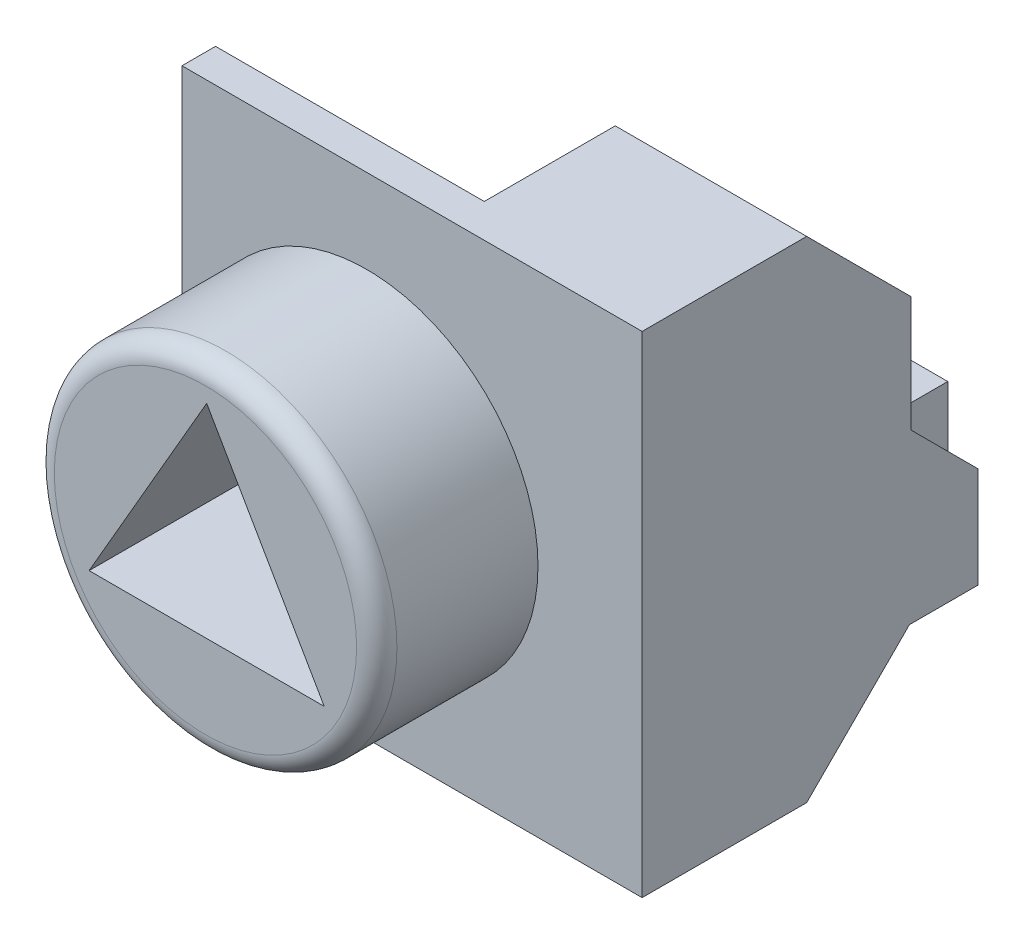
ISO-10303-21;
HEADER;
FILE_DESCRIPTION(('STEP AP214'),'2;1');
FILE_NAME('part.step','',(''),(''),'','','');
FILE_SCHEMA(('AUTOMOTIVE_DESIGN { 1 0 10303 214 1 1 1 1 }'));
ENDSEC;
DATA;
#1=APPLICATION_CONTEXT('core data for automotive mechanical design processes');
#2=APPLICATION_PROTOCOL_DEFINITION('international standard','automotive_design',2000,#1);
#3=PRODUCT_CONTEXT('',#1,'mechanical');
#4=PRODUCT('Part','Part','',(#3));
#5=PRODUCT_RELATED_PRODUCT_CATEGORY('part','',(#4));
#6=PRODUCT_DEFINITION_FORMATION('','',#4);
#7=PRODUCT_DEFINITION_CONTEXT('part definition',#1,'design');
#8=PRODUCT_DEFINITION('design','',#6,#7);
#9=PRODUCT_DEFINITION_SHAPE('','',#8);
#10=(LENGTH_UNIT() NAMED_UNIT(*) SI_UNIT(.MILLI.,.METRE.));
#11=(NAMED_UNIT(*) PLANE_ANGLE_UNIT() SI_UNIT($,.RADIAN.));
#12=(NAMED_UNIT(*) SI_UNIT($,.STERADIAN.) SOLID_ANGLE_UNIT());
#13=UNCERTAINTY_MEASURE_WITH_UNIT(LENGTH_MEASURE(1.E-05),#10,'distance_accuracy_value','');
#14=(GEOMETRIC_REPRESENTATION_CONTEXT(3) GLOBAL_UNCERTAINTY_ASSIGNED_CONTEXT((#13)) GLOBAL_UNIT_ASSIGNED_CONTEXT((#10,
#11,#12)) REPRESENTATION_CONTEXT('',''));
#15=CARTESIAN_POINT('',(0.,0.,0.));
#16=DIRECTION('',(0.,0.,1.));
#17=DIRECTION('',(1.,0.,0.));
#18=AXIS2_PLACEMENT_3D('',#15,#16,#17);
#19=CARTESIAN_POINT('',(0.,0.,-1.));
#20=DIRECTION('',(0.,0.,-1.));
#21=DIRECTION('',(-1.,0.,0.));
#22=AXIS2_PLACEMENT_3D('',#19,#20,#21);
#23=PLANE('',#22);
#24=CARTESIAN_POINT('',(0.,9.48,-1.));
#25=DIRECTION('',(0.,0.,1.));
#26=DIRECTION('',(1.,0.,0.));
#27=AXIS2_PLACEMENT_3D('',#24,#25,#26);
#28=CIRCLE('',#27,1.);
#29=CARTESIAN_POINT('',(1.,9.48,-1.));
#30=VERTEX_POINT('',#29);
#31=EDGE_CURVE('E267',#30,#30,#28,.T.);
#32=ORIENTED_EDGE('',*,*,#31,.T.);
#33=EDGE_LOOP('',(#32));
#34=FACE_BOUND('',#33,.T.);
#35=DIRECTION('',(1.,0.,0.));
#36=VECTOR('',#35,1.);
#37=CARTESIAN_POINT('',(5.5,17.08,-1.));
#38=LINE('',#37,#36);
#39=CARTESIAN_POINT('',(-5.5,17.08,-1.));
#40=VERTEX_POINT('',#39);
#41=CARTESIAN_POINT('',(2.5,17.08,-1.));
#42=VERTEX_POINT('',#41);
#43=EDGE_CURVE('E319',#40,#42,#38,.T.);
#44=ORIENTED_EDGE('',*,*,#43,.T.);
#45=DIRECTION('',(0.,1.,0.));
#46=VECTOR('',#45,1.);
#47=CARTESIAN_POINT('',(2.5,17.08,-1.));
#48=LINE('',#47,#46);
#49=CARTESIAN_POINT('',(2.5,2.48,-1.));
#50=VERTEX_POINT('',#49);
#51=EDGE_CURVE('E244',#50,#42,#48,.T.);
#52=ORIENTED_EDGE('',*,*,#51,.F.);
#53=DIRECTION('',(-1.,0.,0.));
#54=VECTOR('',#53,1.);
#55=CARTESIAN_POINT('',(5.5,2.48,-1.));
#56=LINE('',#55,#54);
#57=CARTESIAN_POINT('',(-5.5,2.48,-1.));
#58=VERTEX_POINT('',#57);
#59=EDGE_CURVE('E312',#50,#58,#56,.T.);
#60=ORIENTED_EDGE('',*,*,#59,.T.);
#61=DIRECTION('',(0.,1.,0.));
#62=VECTOR('',#61,1.);
#63=CARTESIAN_POINT('',(-5.5,17.08,-1.));
#64=LINE('',#63,#62);
#65=EDGE_CURVE('E315',#58,#40,#64,.T.);
#66=ORIENTED_EDGE('',*,*,#65,.T.);
#67=EDGE_LOOP('',(#44,#52,#60,#66));
#68=FACE_BOUND('',#67,.T.);
#69=ADVANCED_FACE('F45',(#34,#68),#23,.T.);
#70=CARTESIAN_POINT('',(0.,9.48,4.8));
#71=DIRECTION('',(0.,0.,-1.));
#72=DIRECTION('',(-1.,0.,0.));
#73=AXIS2_PLACEMENT_3D('',#70,#71,#72);
#74=CYLINDRICAL_SURFACE('',#73,5.1);
#75=CARTESIAN_POINT('',(0.,9.48,4.2));
#76=DIRECTION('',(0.,0.,1.));
#77=DIRECTION('',(1.,0.,0.));
#78=AXIS2_PLACEMENT_3D('',#75,#76,#77);
#79=CIRCLE('',#78,5.1);
#80=CARTESIAN_POINT('',(5.1,9.48,4.2));
#81=VERTEX_POINT('',#80);
#82=EDGE_CURVE('E346',#81,#81,#79,.F.);
#83=ORIENTED_EDGE('',*,*,#82,.T.);
#84=EDGE_LOOP('',(#83));
#85=FACE_BOUND('',#84,.T.);
#86=CARTESIAN_POINT('',(0.,9.48,0.));
#87=DIRECTION('',(0.,0.,1.));
#88=DIRECTION('',(1.,0.,0.));
#89=AXIS2_PLACEMENT_3D('',#86,#87,#88);
#90=CIRCLE('',#89,5.1);
#91=CARTESIAN_POINT('',(5.1,9.48,0.));
#92=VERTEX_POINT('',#91);
#93=EDGE_CURVE('E338',#92,#92,#90,.T.);
#94=ORIENTED_EDGE('',*,*,#93,.T.);
#95=EDGE_LOOP('',(#94));
#96=FACE_BOUND('',#95,.T.);
#97=ADVANCED_FACE('F457',(#85,#96),#74,.T.);
#98=CARTESIAN_POINT('',(0.,9.48,4.8));
#99=DIRECTION('',(0.,0.,1.));
#100=DIRECTION('',(1.,0.,0.));
#101=AXIS2_PLACEMENT_3D('',#98,#99,#100);
#102=PLANE('',#101);
#103=DIRECTION('',(-0.5,0.866025403784438,0.));
#104=VECTOR('',#103,1.);
#105=CARTESIAN_POINT('',(3.53589838486225,7.48,4.8));
#106=LINE('',#105,#104);
#107=CARTESIAN_POINT('',(3.53589838486225,7.48,4.8));
#108=VERTEX_POINT('',#107);
#109=CARTESIAN_POINT('',(0.0358983848622429,13.5421778264911,4.8));
#110=VERTEX_POINT('',#109);
#111=EDGE_CURVE('E271',#108,#110,#106,.T.);
#112=ORIENTED_EDGE('',*,*,#111,.F.);
#113=DIRECTION('',(1.,0.,0.));
#114=VECTOR('',#113,1.);
#115=CARTESIAN_POINT('',(-3.46410161513775,7.48,4.8));
#116=LINE('',#115,#114);
#117=CARTESIAN_POINT('',(-3.46410161513775,7.48,4.8));
#118=VERTEX_POINT('',#117);
#119=EDGE_CURVE('E280',#118,#108,#116,.T.);
#120=ORIENTED_EDGE('',*,*,#119,.F.);
#121=DIRECTION('',(-0.5,-0.866025403784439,0.));
#122=VECTOR('',#121,1.);
#123=CARTESIAN_POINT('',(0.0358983848622436,13.5421778264911,4.8));
#124=LINE('',#123,#122);
#125=EDGE_CURVE('E291',#110,#118,#124,.T.);
#126=ORIENTED_EDGE('',*,*,#125,.F.);
#127=EDGE_LOOP('',(#112,#120,#126));
#128=FACE_BOUND('',#127,.T.);
#129=CARTESIAN_POINT('',(0.,9.48,4.8));
#130=DIRECTION('',(0.,0.,1.));
#131=DIRECTION('',(1.,0.,0.));
#132=AXIS2_PLACEMENT_3D('',#129,#130,#131);
#133=CIRCLE('',#132,4.5);
#134=CARTESIAN_POINT('',(4.5,9.48,4.8));
#135=VERTEX_POINT('',#134);
#136=EDGE_CURVE('E342',#135,#135,#133,.T.);
#137=ORIENTED_EDGE('',*,*,#136,.T.);
#138=EDGE_LOOP('',(#137));
#139=FACE_BOUND('',#138,.T.);
#140=ADVANCED_FACE('F462',(#128,#139),#102,.T.);
#141=CARTESIAN_POINT('',(5.5,17.08,-1.));
#142=DIRECTION('',(-1.,0.,0.));
#143=DIRECTION('',(0.,-1.,0.));
#144=AXIS2_PLACEMENT_3D('',#141,#142,#143);
#145=PLANE('',#144);
#146=DIRECTION('',(0.,0.,-1.));
#147=VECTOR('',#146,1.);
#148=CARTESIAN_POINT('',(5.5,8.53846540433701,-1.8));
#149=LINE('',#148,#147);
#150=CARTESIAN_POINT('',(5.5,8.53846540433701,-10.));
#151=VERTEX_POINT('',#150);
#152=CARTESIAN_POINT('',(5.5,8.53846540433701,-11.8));
#153=VERTEX_POINT('',#152);
#154=EDGE_CURVE('E241',#151,#153,#149,.T.);
#155=ORIENTED_EDGE('',*,*,#154,.F.);
#156=DIRECTION('',(0.,-1.,0.));
#157=VECTOR('',#156,1.);
#158=CARTESIAN_POINT('',(5.5,0.,-10.));
#159=LINE('',#158,#157);
#160=CARTESIAN_POINT('',(5.5,5.53846540433701,-10.));
#161=VERTEX_POINT('',#160);
#162=EDGE_CURVE('E177',#151,#161,#159,.T.);
#163=ORIENTED_EDGE('',*,*,#162,.T.);
#164=DIRECTION('',(0.,0.,-1.));
#165=VECTOR('',#164,1.);
#166=CARTESIAN_POINT('',(5.5,5.53846540433701,-1.8));
#167=LINE('',#166,#165);
#168=CARTESIAN_POINT('',(5.5,5.53846540433701,-11.8));
#169=VERTEX_POINT('',#168);
#170=EDGE_CURVE('E240',#161,#169,#167,.T.);
#171=ORIENTED_EDGE('',*,*,#170,.T.);
#172=DIRECTION('',(0.,-1.,0.));
#173=VECTOR('',#172,1.);
#174=CARTESIAN_POINT('',(5.5,8.07435186760056,-11.8));
#175=LINE('',#174,#173);
#176=EDGE_CURVE('E301',#153,#169,#175,.T.);
#177=ORIENTED_EDGE('',*,*,#176,.F.);
#178=EDGE_LOOP('',(#155,#163,#171,#177));
#179=FACE_BOUND('',#178,.T.);
#180=ADVANCED_FACE('F438',(#179),#145,.F.);
#181=CARTESIAN_POINT('',(5.5,2.48,-1.));
#182=DIRECTION('',(0.,1.,0.));
#183=DIRECTION('',(0.,0.,1.));
#184=AXIS2_PLACEMENT_3D('',#181,#182,#183);
#185=PLANE('',#184);
#186=DIRECTION('',(0.,0.,1.));
#187=VECTOR('',#186,1.);
#188=CARTESIAN_POINT('',(2.5,2.48,-8.));
#189=LINE('',#188,#187);
#190=CARTESIAN_POINT('',(2.5,2.48,-4.89999999999999));
#191=VERTEX_POINT('',#190);
#192=EDGE_CURVE('E263',#191,#50,#189,.T.);
#193=ORIENTED_EDGE('',*,*,#192,.F.);
#194=DIRECTION('',(1.,0.,0.));
#195=VECTOR('',#194,1.);
#196=CARTESIAN_POINT('',(5.5,2.48,-4.89999999999999));
#197=LINE('',#196,#195);
#198=CARTESIAN_POINT('',(8.2,2.48,-4.89999999999999));
#199=VERTEX_POINT('',#198);
#200=EDGE_CURVE('E359',#191,#199,#197,.T.);
#201=ORIENTED_EDGE('',*,*,#200,.T.);
#202=DIRECTION('',(0.,0.,-1.));
#203=VECTOR('',#202,1.);
#204=CARTESIAN_POINT('',(8.2,2.48,0.));
#205=LINE('',#204,#203);
#206=CARTESIAN_POINT('',(8.2,2.48,0.));
#207=VERTEX_POINT('',#206);
#208=EDGE_CURVE('E218',#207,#199,#205,.T.);
#209=ORIENTED_EDGE('',*,*,#208,.F.);
#210=DIRECTION('',(-1.,0.,0.));
#211=VECTOR('',#210,1.);
#212=CARTESIAN_POINT('',(5.5,2.48,0.));
#213=LINE('',#212,#211);
#214=CARTESIAN_POINT('',(-5.5,2.48,0.));
#215=VERTEX_POINT('',#214);
#216=EDGE_CURVE('E311',#207,#215,#213,.T.);
#217=ORIENTED_EDGE('',*,*,#216,.T.);
#218=DIRECTION('',(0.,0.,1.));
#219=VECTOR('',#218,1.);
#220=CARTESIAN_POINT('',(-5.5,2.48,-1.));
#221=LINE('',#220,#219);
#222=EDGE_CURVE('E334',#58,#215,#221,.T.);
#223=ORIENTED_EDGE('',*,*,#222,.F.);
#224=ORIENTED_EDGE('',*,*,#59,.F.);
#225=EDGE_LOOP('',(#193,#201,#209,#217,#223,#224));
#226=FACE_BOUND('',#225,.T.);
#227=ADVANCED_FACE('F430',(#226),#185,.F.);
#228=CARTESIAN_POINT('',(-5.5,17.08,-1.));
#229=DIRECTION('',(1.,0.,0.));
#230=DIRECTION('',(0.,1.,0.));
#231=AXIS2_PLACEMENT_3D('',#228,#229,#230);
#232=PLANE('',#231);
#233=DIRECTION('',(0.,1.,0.));
#234=VECTOR('',#233,1.);
#235=CARTESIAN_POINT('',(-5.5,17.08,0.));
#236=LINE('',#235,#234);
#237=CARTESIAN_POINT('',(-5.5,17.08,0.));
#238=VERTEX_POINT('',#237);
#239=EDGE_CURVE('E326',#215,#238,#236,.T.);
#240=ORIENTED_EDGE('',*,*,#239,.T.);
#241=DIRECTION('',(0.,0.,1.));
#242=VECTOR('',#241,1.);
#243=CARTESIAN_POINT('',(-5.5,17.08,-1.));
#244=LINE('',#243,#242);
#245=EDGE_CURVE('E323',#40,#238,#244,.T.);
#246=ORIENTED_EDGE('',*,*,#245,.F.);
#247=ORIENTED_EDGE('',*,*,#65,.F.);
#248=ORIENTED_EDGE('',*,*,#222,.T.);
#249=EDGE_LOOP('',(#240,#246,#247,#248));
#250=FACE_BOUND('',#249,.T.);
#251=ADVANCED_FACE('F468',(#250),#232,.F.);
#252=CARTESIAN_POINT('',(5.5,17.08,-1.));
#253=DIRECTION('',(0.,-1.,0.));
#254=DIRECTION('',(0.,0.,-1.));
#255=AXIS2_PLACEMENT_3D('',#252,#253,#254);
#256=PLANE('',#255);
#257=DIRECTION('',(1.,0.,0.));
#258=VECTOR('',#257,1.);
#259=CARTESIAN_POINT('',(5.5,17.08,0.));
#260=LINE('',#259,#258);
#261=CARTESIAN_POINT('',(8.20000000000001,17.08,0.));
#262=VERTEX_POINT('',#261);
#263=EDGE_CURVE('E316',#238,#262,#260,.T.);
#264=ORIENTED_EDGE('',*,*,#263,.T.);
#265=DIRECTION('',(0.,0.,1.));
#266=VECTOR('',#265,1.);
#267=CARTESIAN_POINT('',(8.20000000000001,17.08,0.));
#268=LINE('',#267,#266);
#269=CARTESIAN_POINT('',(8.20000000000001,17.08,-4.89999999999999));
#270=VERTEX_POINT('',#269);
#271=EDGE_CURVE('E210',#270,#262,#268,.T.);
#272=ORIENTED_EDGE('',*,*,#271,.F.);
#273=DIRECTION('',(-1.,0.,0.));
#274=VECTOR('',#273,1.);
#275=CARTESIAN_POINT('',(2.5,17.08,-4.89999999999999));
#276=LINE('',#275,#274);
#277=CARTESIAN_POINT('',(2.5,17.08,-4.89999999999999));
#278=VERTEX_POINT('',#277);
#279=EDGE_CURVE('E362',#270,#278,#276,.T.);
#280=ORIENTED_EDGE('',*,*,#279,.T.);
#281=DIRECTION('',(0.,0.,1.));
#282=VECTOR('',#281,1.);
#283=CARTESIAN_POINT('',(2.5,17.08,-8.));
#284=LINE('',#283,#282);
#285=EDGE_CURVE('E257',#278,#42,#284,.T.);
#286=ORIENTED_EDGE('',*,*,#285,.T.);
#287=ORIENTED_EDGE('',*,*,#43,.F.);
#288=ORIENTED_EDGE('',*,*,#245,.T.);
#289=EDGE_LOOP('',(#264,#272,#280,#286,#287,#288));
#290=FACE_BOUND('',#289,.T.);
#291=ADVANCED_FACE('F413',(#290),#256,.F.);
#292=CARTESIAN_POINT('',(0.,0.,0.));
#293=DIRECTION('',(0.,0.,-1.));
#294=DIRECTION('',(-1.,0.,0.));
#295=AXIS2_PLACEMENT_3D('',#292,#293,#294);
#296=PLANE('',#295);
#297=ORIENTED_EDGE('',*,*,#93,.F.);
#298=EDGE_LOOP('',(#297));
#299=FACE_BOUND('',#298,.T.);
#300=ORIENTED_EDGE('',*,*,#216,.F.);
#301=DIRECTION('',(0.,-1.,0.));
#302=VECTOR('',#301,1.);
#303=CARTESIAN_POINT('',(8.2,0.,0.));
#304=LINE('',#303,#302);
#305=EDGE_CURVE('E214',#262,#207,#304,.T.);
#306=ORIENTED_EDGE('',*,*,#305,.F.);
#307=ORIENTED_EDGE('',*,*,#263,.F.);
#308=ORIENTED_EDGE('',*,*,#239,.F.);
#309=EDGE_LOOP('',(#300,#306,#307,#308));
#310=FACE_BOUND('',#309,.T.);
#311=ADVANCED_FACE('F426',(#299,#310),#296,.F.);
#312=CARTESIAN_POINT('',(4.41513169682799,7.03846540433701,-11.8));
#313=DIRECTION('',(0.,0.,-1.));
#314=DIRECTION('',(-1.,0.,0.));
#315=AXIS2_PLACEMENT_3D('',#312,#313,#314);
#316=PLANE('',#315);
#317=ORIENTED_EDGE('',*,*,#176,.T.);
#318=DIRECTION('',(-1.,0.,0.));
#319=VECTOR('',#318,1.);
#320=CARTESIAN_POINT('',(5.5,5.53846540433701,-11.8));
#321=LINE('',#320,#319);
#322=CARTESIAN_POINT('',(2.91513169682799,5.53846540433701,-11.8));
#323=VERTEX_POINT('',#322);
#324=EDGE_CURVE('E182',#169,#323,#321,.T.);
#325=ORIENTED_EDGE('',*,*,#324,.T.);
#326=DIRECTION('',(0.,1.,0.));
#327=VECTOR('',#326,1.);
#328=CARTESIAN_POINT('',(2.91513169682799,5.53846540433701,-11.8));
#329=LINE('',#328,#327);
#330=CARTESIAN_POINT('',(2.91513169682799,8.53846540433701,-11.8));
#331=VERTEX_POINT('',#330);
#332=EDGE_CURVE('E232',#323,#331,#329,.T.);
#333=ORIENTED_EDGE('',*,*,#332,.T.);
#334=DIRECTION('',(1.,0.,0.));
#335=VECTOR('',#334,1.);
#336=CARTESIAN_POINT('',(5.5,8.53846540433701,-11.8));
#337=LINE('',#336,#335);
#338=EDGE_CURVE('E236',#331,#153,#337,.T.);
#339=ORIENTED_EDGE('',*,*,#338,.T.);
#340=EDGE_LOOP('',(#317,#325,#333,#339));
#341=FACE_BOUND('',#340,.T.);
#342=ADVANCED_FACE('F440',(#341),#316,.T.);
#343=CARTESIAN_POINT('',(0.,9.48,4.2));
#344=DIRECTION('',(0.,0.,1.));
#345=DIRECTION('',(1.,0.,0.));
#346=AXIS2_PLACEMENT_3D('',#343,#344,#345);
#347=TOROIDAL_SURFACE('',#346,4.5,0.6);
#348=ORIENTED_EDGE('',*,*,#82,.F.);
#349=EDGE_LOOP('',(#348));
#350=FACE_BOUND('',#349,.T.);
#351=ORIENTED_EDGE('',*,*,#136,.F.);
#352=EDGE_LOOP('',(#351));
#353=FACE_BOUND('',#352,.T.);
#354=ADVANCED_FACE('F442',(#350,#353),#347,.T.);
#355=CARTESIAN_POINT('',(3.53589838486225,7.48,0.));
#356=DIRECTION('',(0.866025403784438,0.5,0.));
#357=DIRECTION('',(-0.5,0.866025403784439,0.));
#358=AXIS2_PLACEMENT_3D('',#355,#356,#357);
#359=PLANE('',#358);
#360=ORIENTED_EDGE('',*,*,#111,.T.);
#361=DIRECTION('',(0.,0.,1.));
#362=VECTOR('',#361,1.);
#363=CARTESIAN_POINT('',(0.0358983848622436,13.5421778264911,0.));
#364=LINE('',#363,#362);
#365=CARTESIAN_POINT('',(0.0358983848622436,13.5421778264911,0.));
#366=VERTEX_POINT('',#365);
#367=EDGE_CURVE('E288',#366,#110,#364,.T.);
#368=ORIENTED_EDGE('',*,*,#367,.F.);
#369=DIRECTION('',(-0.5,0.866025403784438,0.));
#370=VECTOR('',#369,1.);
#371=CARTESIAN_POINT('',(3.53589838486225,7.48,0.));
#372=LINE('',#371,#370);
#373=CARTESIAN_POINT('',(3.53589838486225,7.48,0.));
#374=VERTEX_POINT('',#373);
#375=EDGE_CURVE('E275',#374,#366,#372,.T.);
#376=ORIENTED_EDGE('',*,*,#375,.F.);
#377=DIRECTION('',(0.,0.,1.));
#378=VECTOR('',#377,1.);
#379=CARTESIAN_POINT('',(3.53589838486225,7.48,0.));
#380=LINE('',#379,#378);
#381=EDGE_CURVE('E298',#374,#108,#380,.T.);
#382=ORIENTED_EDGE('',*,*,#381,.T.);
#383=EDGE_LOOP('',(#360,#368,#376,#382));
#384=FACE_BOUND('',#383,.T.);
#385=ADVANCED_FACE('F448',(#384),#359,.F.);
#386=CARTESIAN_POINT('',(-3.46410161513775,7.48,0.));
#387=DIRECTION('',(0.,-1.,0.));
#388=DIRECTION('',(0.,0.,-1.));
#389=AXIS2_PLACEMENT_3D('',#386,#387,#388);
#390=PLANE('',#389);
#391=ORIENTED_EDGE('',*,*,#119,.T.);
#392=ORIENTED_EDGE('',*,*,#381,.F.);
#393=DIRECTION('',(1.,0.,0.));
#394=VECTOR('',#393,1.);
#395=CARTESIAN_POINT('',(-3.46410161513775,7.48,0.));
#396=LINE('',#395,#394);
#397=CARTESIAN_POINT('',(-3.46410161513775,7.48,0.));
#398=VERTEX_POINT('',#397);
#399=EDGE_CURVE('E284',#398,#374,#396,.T.);
#400=ORIENTED_EDGE('',*,*,#399,.F.);
#401=DIRECTION('',(0.,0.,1.));
#402=VECTOR('',#401,1.);
#403=CARTESIAN_POINT('',(-3.46410161513775,7.48,0.));
#404=LINE('',#403,#402);
#405=EDGE_CURVE('E302',#398,#118,#404,.T.);
#406=ORIENTED_EDGE('',*,*,#405,.T.);
#407=EDGE_LOOP('',(#391,#392,#400,#406));
#408=FACE_BOUND('',#407,.T.);
#409=ADVANCED_FACE('F515',(#408),#390,.F.);
#410=CARTESIAN_POINT('',(0.0358983848622436,13.5421778264911,0.));
#411=DIRECTION('',(-0.866025403784439,0.5,0.));
#412=DIRECTION('',(-0.5,-0.866025403784439,0.));
#413=AXIS2_PLACEMENT_3D('',#410,#411,#412);
#414=PLANE('',#413);
#415=ORIENTED_EDGE('',*,*,#125,.T.);
#416=ORIENTED_EDGE('',*,*,#405,.F.);
#417=DIRECTION('',(-0.5,-0.866025403784439,0.));
#418=VECTOR('',#417,1.);
#419=CARTESIAN_POINT('',(0.0358983848622436,13.5421778264911,0.));
#420=LINE('',#419,#418);
#421=EDGE_CURVE('E279',#366,#398,#420,.T.);
#422=ORIENTED_EDGE('',*,*,#421,.F.);
#423=ORIENTED_EDGE('',*,*,#367,.T.);
#424=EDGE_LOOP('',(#415,#416,#422,#423));
#425=FACE_BOUND('',#424,.T.);
#426=ADVANCED_FACE('F513',(#425),#414,.F.);
#427=CARTESIAN_POINT('',(0.,0.,0.));
#428=DIRECTION('',(0.,0.,1.));
#429=DIRECTION('',(1.,0.,0.));
#430=AXIS2_PLACEMENT_3D('',#427,#428,#429);
#431=PLANE('',#430);
#432=CARTESIAN_POINT('',(0.,9.48,0.));
#433=DIRECTION('',(0.,0.,1.));
#434=DIRECTION('',(1.,0.,0.));
#435=AXIS2_PLACEMENT_3D('',#432,#433,#434);
#436=CIRCLE('',#435,1.);
#437=CARTESIAN_POINT('',(1.,9.48,0.));
#438=VERTEX_POINT('',#437);
#439=EDGE_CURVE('E266',#438,#438,#436,.T.);
#440=ORIENTED_EDGE('',*,*,#439,.F.);
#441=EDGE_LOOP('',(#440));
#442=FACE_BOUND('',#441,.T.);
#443=ORIENTED_EDGE('',*,*,#375,.T.);
#444=ORIENTED_EDGE('',*,*,#421,.T.);
#445=ORIENTED_EDGE('',*,*,#399,.T.);
#446=EDGE_LOOP('',(#443,#444,#445));
#447=FACE_BOUND('',#446,.T.);
#448=ADVANCED_FACE('F509',(#442,#447),#431,.T.);
#449=CARTESIAN_POINT('',(0.,9.48,-1.));
#450=DIRECTION('',(0.,0.,1.));
#451=DIRECTION('',(1.,0.,0.));
#452=AXIS2_PLACEMENT_3D('',#449,#450,#451);
#453=CYLINDRICAL_SURFACE('',#452,1.);
#454=ORIENTED_EDGE('',*,*,#31,.F.);
#455=EDGE_LOOP('',(#454));
#456=FACE_BOUND('',#455,.T.);
#457=ORIENTED_EDGE('',*,*,#439,.T.);
#458=EDGE_LOOP('',(#457));
#459=FACE_BOUND('',#458,.T.);
#460=ADVANCED_FACE('F506',(#456,#459),#453,.F.);
#461=CARTESIAN_POINT('',(2.5,17.08,-8.));
#462=DIRECTION('',(1.,0.,0.));
#463=DIRECTION('',(0.,1.,0.));
#464=AXIS2_PLACEMENT_3D('',#461,#462,#463);
#465=PLANE('',#464);
#466=DIRECTION('',(0.,0.707106781186544,0.707106781186551));
#467=VECTOR('',#466,1.);
#468=CARTESIAN_POINT('',(2.5,13.8092327021685,-4.7292327021685));
#469=LINE('',#468,#467);
#470=CARTESIAN_POINT('',(2.5,10.538465404337,-8.));
#471=VERTEX_POINT('',#470);
#472=CARTESIAN_POINT('',(2.5,8.95359710116497,-9.58486830317205));
#473=VERTEX_POINT('',#472);
#474=EDGE_CURVE('E11',#471,#473,#469,.F.);
#475=ORIENTED_EDGE('',*,*,#474,.T.);
#476=DIRECTION('',(0.,1.,0.));
#477=VECTOR('',#476,1.);
#478=CARTESIAN_POINT('',(2.5,17.08,-9.58486830317205));
#479=LINE('',#478,#477);
#480=CARTESIAN_POINT('',(2.5,7.16486830317203,-9.58486830317205));
#481=VERTEX_POINT('',#480);
#482=EDGE_CURVE('E384',#473,#481,#479,.F.);
#483=ORIENTED_EDGE('',*,*,#482,.T.);
#484=DIRECTION('',(0.,-0.707106781186546,0.707106781186549));
#485=VECTOR('',#484,1.);
#486=CARTESIAN_POINT('',(2.5,5.57999999999999,-8.));
#487=LINE('',#486,#485);
#488=EDGE_CURVE('E71',#481,#191,#487,.T.);
#489=ORIENTED_EDGE('',*,*,#488,.T.);
#490=ORIENTED_EDGE('',*,*,#192,.T.);
#491=ORIENTED_EDGE('',*,*,#51,.T.);
#492=ORIENTED_EDGE('',*,*,#285,.F.);
#493=DIRECTION('',(0.,-0.707106781186546,-0.707106781186549));
#494=VECTOR('',#493,1.);
#495=CARTESIAN_POINT('',(2.5,13.98,-8.));
#496=LINE('',#495,#494);
#497=CARTESIAN_POINT('',(2.5,13.98,-8.));
#498=VERTEX_POINT('',#497);
#499=EDGE_CURVE('E353',#278,#498,#496,.T.);
#500=ORIENTED_EDGE('',*,*,#499,.T.);
#501=DIRECTION('',(0.,1.,0.));
#502=VECTOR('',#501,1.);
#503=CARTESIAN_POINT('',(2.5,17.08,-8.));
#504=LINE('',#503,#502);
#505=EDGE_CURVE('E254',#471,#498,#504,.T.);
#506=ORIENTED_EDGE('',*,*,#505,.F.);
#507=EDGE_LOOP('',(#475,#483,#489,#490,#491,#492,#500,#506));
#508=FACE_BOUND('',#507,.T.);
#509=ADVANCED_FACE('F402',(#508),#465,.F.);
#510=CARTESIAN_POINT('',(0.,0.,-8.));
#511=DIRECTION('',(0.,0.,-1.));
#512=DIRECTION('',(-1.,0.,0.));
#513=AXIS2_PLACEMENT_3D('',#510,#511,#512);
#514=PLANE('',#513);
#515=DIRECTION('',(-1.,0.,0.));
#516=VECTOR('',#515,1.);
#517=CARTESIAN_POINT('',(2.91513169682799,10.538465404337,-8.));
#518=LINE('',#517,#516);
#519=CARTESIAN_POINT('',(8.2,10.538465404337,-8.));
#520=VERTEX_POINT('',#519);
#521=EDGE_CURVE('E188',#520,#471,#518,.T.);
#522=ORIENTED_EDGE('',*,*,#521,.T.);
#523=ORIENTED_EDGE('',*,*,#505,.T.);
#524=DIRECTION('',(1.,0.,0.));
#525=VECTOR('',#524,1.);
#526=CARTESIAN_POINT('',(5.5,13.98,-8.));
#527=LINE('',#526,#525);
#528=CARTESIAN_POINT('',(8.2,13.98,-8.));
#529=VERTEX_POINT('',#528);
#530=EDGE_CURVE('E350',#498,#529,#527,.T.);
#531=ORIENTED_EDGE('',*,*,#530,.T.);
#532=DIRECTION('',(0.,1.,0.));
#533=VECTOR('',#532,1.);
#534=CARTESIAN_POINT('',(8.2,0.,-8.));
#535=LINE('',#534,#533);
#536=EDGE_CURVE('E193',#520,#529,#535,.T.);
#537=ORIENTED_EDGE('',*,*,#536,.F.);
#538=EDGE_LOOP('',(#522,#523,#531,#537));
#539=FACE_BOUND('',#538,.T.);
#540=ADVANCED_FACE('F407',(#539),#514,.T.);
#541=CARTESIAN_POINT('',(0.,5.57999999999999,-8.));
#542=DIRECTION('',(0.,-0.707106781186549,-0.707106781186546));
#543=DIRECTION('',(1.,0.,0.));
#544=AXIS2_PLACEMENT_3D('',#541,#542,#543);
#545=PLANE('',#544);
#546=DIRECTION('',(0.,0.707106781186546,-0.707106781186549));
#547=VECTOR('',#546,1.);
#548=CARTESIAN_POINT('',(2.91513169682799,5.57999999999999,-8.));
#549=LINE('',#548,#547);
#550=CARTESIAN_POINT('',(2.91513169682799,5.53846540433701,-7.95846540433701));
#551=VERTEX_POINT('',#550);
#552=CARTESIAN_POINT('',(2.91513169682799,7.58000000000002,-10.));
#553=VERTEX_POINT('',#552);
#554=EDGE_CURVE('E369',#551,#553,#549,.T.);
#555=ORIENTED_EDGE('',*,*,#554,.F.);
#556=DIRECTION('',(-1.,0.,0.));
#557=VECTOR('',#556,1.);
#558=CARTESIAN_POINT('',(0.,5.53846540433701,-7.95846540433701));
#559=LINE('',#558,#557);
#560=CARTESIAN_POINT('',(8.2,5.53846540433701,-7.95846540433701));
#561=VERTEX_POINT('',#560);
#562=EDGE_CURVE('E365',#561,#551,#559,.T.);
#563=ORIENTED_EDGE('',*,*,#562,.F.);
#564=DIRECTION('',(0.,0.707106781186546,-0.707106781186549));
#565=VECTOR('',#564,1.);
#566=CARTESIAN_POINT('',(8.2,-1.20999999999999,-1.20999999999998));
#567=LINE('',#566,#565);
#568=EDGE_CURVE('E222',#199,#561,#567,.T.);
#569=ORIENTED_EDGE('',*,*,#568,.F.);
#570=ORIENTED_EDGE('',*,*,#200,.F.);
#571=ORIENTED_EDGE('',*,*,#488,.F.);
#572=DIRECTION('',(-0.577350269189623,-0.577350269189626,0.577350269189629));
#573=VECTOR('',#572,1.);
#574=CARTESIAN_POINT('',(2.23462016494032,6.89948846811235,-9.31948846811236));
#575=LINE('',#574,#573);
#576=EDGE_CURVE('E55',#481,#553,#575,.F.);
#577=ORIENTED_EDGE('',*,*,#576,.T.);
#578=EDGE_LOOP('',(#555,#563,#569,#570,#571,#577));
#579=FACE_BOUND('',#578,.T.);
#580=ADVANCED_FACE('F389',(#579),#545,.T.);
#581=CARTESIAN_POINT('',(0.,13.98,-8.));
#582=DIRECTION('',(0.,0.707106781186549,-0.707106781186546));
#583=DIRECTION('',(-1.,0.,0.));
#584=AXIS2_PLACEMENT_3D('',#581,#582,#583);
#585=PLANE('',#584);
#586=ORIENTED_EDGE('',*,*,#499,.F.);
#587=ORIENTED_EDGE('',*,*,#279,.F.);
#588=DIRECTION('',(0.,0.707106781186546,0.707106781186549));
#589=VECTOR('',#588,1.);
#590=CARTESIAN_POINT('',(8.2,10.99,-10.99));
#591=LINE('',#590,#589);
#592=EDGE_CURVE('E206',#529,#270,#591,.T.);
#593=ORIENTED_EDGE('',*,*,#592,.F.);
#594=ORIENTED_EDGE('',*,*,#530,.F.);
#595=EDGE_LOOP('',(#586,#587,#593,#594));
#596=FACE_BOUND('',#595,.T.);
#597=ADVANCED_FACE('F411',(#596),#585,.T.);
#598=CARTESIAN_POINT('',(5.5,8.53846540433701,-1.8));
#599=DIRECTION('',(0.,1.,0.));
#600=DIRECTION('',(0.,0.,1.));
#601=AXIS2_PLACEMENT_3D('',#598,#599,#600);
#602=PLANE('',#601);
#603=DIRECTION('',(0.,0.,-1.));
#604=VECTOR('',#603,1.);
#605=CARTESIAN_POINT('',(2.91513169682799,8.53846540433701,-1.8));
#606=LINE('',#605,#604);
#607=CARTESIAN_POINT('',(2.91513169682799,8.53846540433701,-10.));
#608=VERTEX_POINT('',#607);
#609=EDGE_CURVE('E245',#608,#331,#606,.T.);
#610=ORIENTED_EDGE('',*,*,#609,.F.);
#611=DIRECTION('',(1.,0.,0.));
#612=VECTOR('',#611,1.);
#613=CARTESIAN_POINT('',(5.5,8.53846540433701,-10.));
#614=LINE('',#613,#612);
#615=EDGE_CURVE('E372',#608,#151,#614,.T.);
#616=ORIENTED_EDGE('',*,*,#615,.T.);
#617=ORIENTED_EDGE('',*,*,#154,.T.);
#618=ORIENTED_EDGE('',*,*,#338,.F.);
#619=EDGE_LOOP('',(#610,#616,#617,#618));
#620=FACE_BOUND('',#619,.T.);
#621=ADVANCED_FACE('F398',(#620),#602,.T.);
#622=CARTESIAN_POINT('',(2.91513169682799,5.53846540433701,-1.8));
#623=DIRECTION('',(-1.,0.,0.));
#624=DIRECTION('',(0.,0.,1.));
#625=AXIS2_PLACEMENT_3D('',#622,#623,#624);
#626=PLANE('',#625);
#627=ORIENTED_EDGE('',*,*,#554,.T.);
#628=DIRECTION('',(0.,1.,0.));
#629=VECTOR('',#628,1.);
#630=CARTESIAN_POINT('',(2.91513169682799,10.538465404337,-10.));
#631=LINE('',#630,#629);
#632=EDGE_CURVE('E377',#553,#608,#631,.T.);
#633=ORIENTED_EDGE('',*,*,#632,.T.);
#634=ORIENTED_EDGE('',*,*,#609,.T.);
#635=ORIENTED_EDGE('',*,*,#332,.F.);
#636=DIRECTION('',(0.,0.,-1.));
#637=VECTOR('',#636,1.);
#638=CARTESIAN_POINT('',(2.91513169682799,5.53846540433701,-1.8));
#639=LINE('',#638,#637);
#640=EDGE_CURVE('E248',#551,#323,#639,.T.);
#641=ORIENTED_EDGE('',*,*,#640,.F.);
#642=EDGE_LOOP('',(#627,#633,#634,#635,#641));
#643=FACE_BOUND('',#642,.T.);
#644=ADVANCED_FACE('F394',(#643),#626,.T.);
#645=CARTESIAN_POINT('',(5.5,5.53846540433701,-1.8));
#646=DIRECTION('',(0.,-1.,0.));
#647=DIRECTION('',(0.,0.,-1.));
#648=AXIS2_PLACEMENT_3D('',#645,#646,#647);
#649=PLANE('',#648);
#650=ORIENTED_EDGE('',*,*,#170,.F.);
#651=DIRECTION('',(-1.,0.,0.));
#652=VECTOR('',#651,1.);
#653=CARTESIAN_POINT('',(8.2,5.53846540433701,-10.));
#654=LINE('',#653,#652);
#655=CARTESIAN_POINT('',(8.2,5.53846540433701,-10.));
#656=VERTEX_POINT('',#655);
#657=EDGE_CURVE('E62',#656,#161,#654,.T.);
#658=ORIENTED_EDGE('',*,*,#657,.F.);
#659=DIRECTION('',(0.,0.,-1.));
#660=VECTOR('',#659,1.);
#661=CARTESIAN_POINT('',(8.2,5.53846540433701,0.));
#662=LINE('',#661,#660);
#663=EDGE_CURVE('E198',#561,#656,#662,.T.);
#664=ORIENTED_EDGE('',*,*,#663,.F.);
#665=ORIENTED_EDGE('',*,*,#562,.T.);
#666=ORIENTED_EDGE('',*,*,#640,.T.);
#667=ORIENTED_EDGE('',*,*,#324,.F.);
#668=EDGE_LOOP('',(#650,#658,#664,#665,#666,#667));
#669=FACE_BOUND('',#668,.T.);
#670=ADVANCED_FACE('F434',(#669),#649,.T.);
#671=CARTESIAN_POINT('',(5.5,8.53846540433701,-10.));
#672=DIRECTION('',(0.,0.707106781186551,-0.707106781186544));
#673=DIRECTION('',(-1.,0.,0.));
#674=AXIS2_PLACEMENT_3D('',#671,#672,#673);
#675=PLANE('',#674);
#676=ORIENTED_EDGE('',*,*,#615,.F.);
#677=DIRECTION('',(-0.577350269189624,0.577350269189624,0.57735026918963));
#678=VECTOR('',#677,1.);
#679=CARTESIAN_POINT('',(3.77675446455197,7.676842636613,-10.861622767724));
#680=LINE('',#679,#678);
#681=EDGE_CURVE('E381',#608,#473,#680,.T.);
#682=ORIENTED_EDGE('',*,*,#681,.T.);
#683=ORIENTED_EDGE('',*,*,#474,.F.);
#684=ORIENTED_EDGE('',*,*,#521,.F.);
#685=DIRECTION('',(0.,0.707106781186544,0.707106781186551));
#686=VECTOR('',#685,1.);
#687=CARTESIAN_POINT('',(8.2,9.26923270216855,-9.26923270216845));
#688=LINE('',#687,#686);
#689=CARTESIAN_POINT('',(8.2,8.53846540433701,-10.));
#690=VERTEX_POINT('',#689);
#691=EDGE_CURVE('E185',#690,#520,#688,.T.);
#692=ORIENTED_EDGE('',*,*,#691,.F.);
#693=DIRECTION('',(-1.,0.,0.));
#694=VECTOR('',#693,1.);
#695=CARTESIAN_POINT('',(8.2,8.53846540433701,-10.));
#696=LINE('',#695,#694);
#697=EDGE_CURVE('E172',#690,#151,#696,.T.);
#698=ORIENTED_EDGE('',*,*,#697,.T.);
#699=EDGE_LOOP('',(#676,#682,#683,#684,#692,#698));
#700=FACE_BOUND('',#699,.T.);
#701=ADVANCED_FACE('F186',(#700),#675,.T.);
#702=CARTESIAN_POINT('',(2.91513169682799,5.53846540433701,-10.));
#703=DIRECTION('',(-0.707106781186551,0.,-0.707106781186544));
#704=DIRECTION('',(0.,-1.,0.));
#705=AXIS2_PLACEMENT_3D('',#702,#703,#704);
#706=PLANE('',#705);
#707=ORIENTED_EDGE('',*,*,#576,.F.);
#708=ORIENTED_EDGE('',*,*,#482,.F.);
#709=ORIENTED_EDGE('',*,*,#681,.F.);
#710=ORIENTED_EDGE('',*,*,#632,.F.);
#711=EDGE_LOOP('',(#707,#708,#709,#710));
#712=FACE_BOUND('',#711,.T.);
#713=ADVANCED_FACE('F48',(#712),#706,.T.);
#714=CARTESIAN_POINT('',(8.2,0.,-10.));
#715=DIRECTION('',(0.,0.,-1.));
#716=DIRECTION('',(-1.,0.,0.));
#717=AXIS2_PLACEMENT_3D('',#714,#715,#716);
#718=PLANE('',#717);
#719=ORIENTED_EDGE('',*,*,#162,.F.);
#720=ORIENTED_EDGE('',*,*,#697,.F.);
#721=DIRECTION('',(0.,-1.,0.));
#722=VECTOR('',#721,1.);
#723=CARTESIAN_POINT('',(8.2,0.,-10.));
#724=LINE('',#723,#722);
#725=EDGE_CURVE('E176',#690,#656,#724,.T.);
#726=ORIENTED_EDGE('',*,*,#725,.T.);
#727=ORIENTED_EDGE('',*,*,#657,.T.);
#728=EDGE_LOOP('',(#719,#720,#726,#727));
#729=FACE_BOUND('',#728,.T.);
#730=ADVANCED_FACE('F174',(#729),#718,.T.);
#731=CARTESIAN_POINT('',(8.2,0.,0.));
#732=DIRECTION('',(1.,0.,0.));
#733=DIRECTION('',(0.,1.,0.));
#734=AXIS2_PLACEMENT_3D('',#731,#732,#733);
#735=PLANE('',#734);
#736=ORIENTED_EDGE('',*,*,#725,.F.);
#737=ORIENTED_EDGE('',*,*,#691,.T.);
#738=ORIENTED_EDGE('',*,*,#536,.T.);
#739=ORIENTED_EDGE('',*,*,#592,.T.);
#740=ORIENTED_EDGE('',*,*,#271,.T.);
#741=ORIENTED_EDGE('',*,*,#305,.T.);
#742=ORIENTED_EDGE('',*,*,#208,.T.);
#743=ORIENTED_EDGE('',*,*,#568,.T.);
#744=ORIENTED_EDGE('',*,*,#663,.T.);
#745=EDGE_LOOP('',(#736,#737,#738,#739,#740,#741,#742,#743,#744));
#746=FACE_BOUND('',#745,.T.);
#747=ADVANCED_FACE('F195',(#746),#735,.T.);
#748=CLOSED_SHELL('',(#69,#97,#140,#180,#227,#251,#291,#311,#342,#354,#385,#409,#426,#448,#460,
#509,#540,#580,#597,#621,#644,#670,#701,#713,#730,#747));
#749=MANIFOLD_SOLID_BREP('B2',#748);
#750=ADVANCED_BREP_SHAPE_REPRESENTATION('',(#18,#749),#14);
#751=SHAPE_DEFINITION_REPRESENTATION(#9,#750);
ENDSEC;
END-ISO-10303-21;
